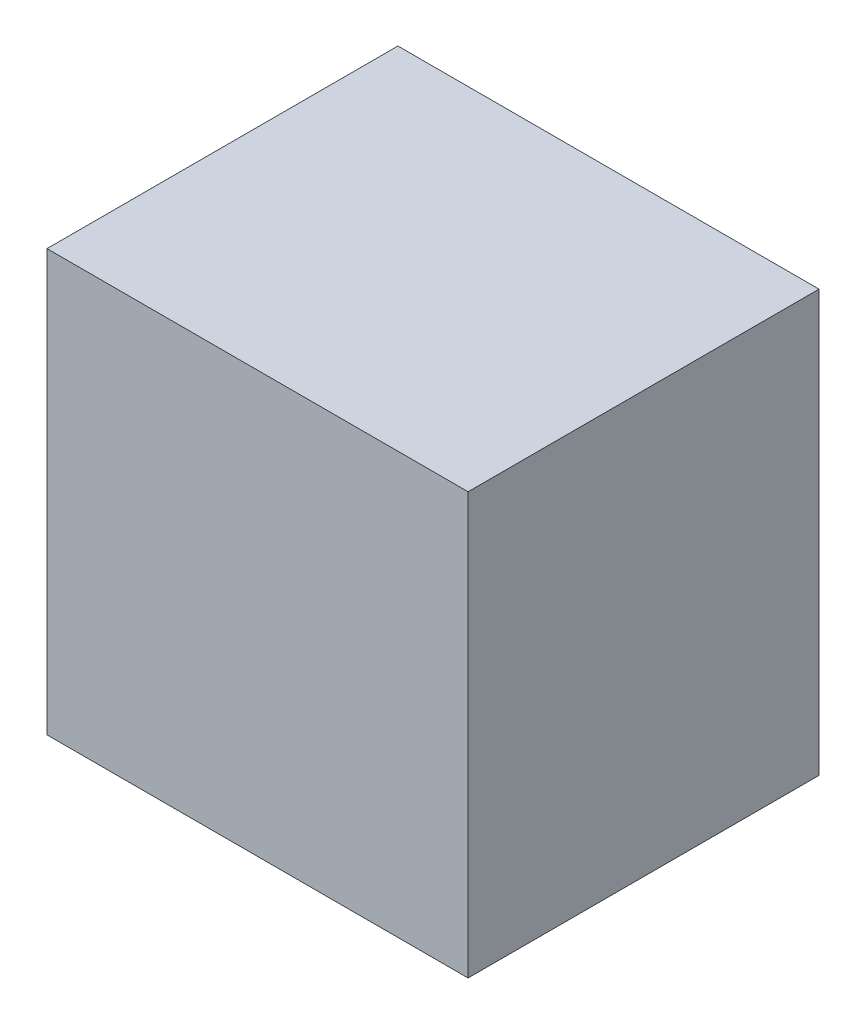
ISO-10303-21;
HEADER;
FILE_DESCRIPTION(('STEP AP214'),'2;1');
FILE_NAME('part.step','',(''),(''),'','','');
FILE_SCHEMA(('AUTOMOTIVE_DESIGN { 1 0 10303 214 1 1 1 1 }'));
ENDSEC;
DATA;
#1=APPLICATION_CONTEXT('core data for automotive mechanical design processes');
#2=APPLICATION_PROTOCOL_DEFINITION('international standard','automotive_design',2000,#1);
#3=PRODUCT_CONTEXT('',#1,'mechanical');
#4=PRODUCT('Part','Part','',(#3));
#5=PRODUCT_RELATED_PRODUCT_CATEGORY('part','',(#4));
#6=PRODUCT_DEFINITION_FORMATION('','',#4);
#7=PRODUCT_DEFINITION_CONTEXT('part definition',#1,'design');
#8=PRODUCT_DEFINITION('design','',#6,#7);
#9=PRODUCT_DEFINITION_SHAPE('','',#8);
#10=(LENGTH_UNIT() NAMED_UNIT(*) SI_UNIT(.MILLI.,.METRE.));
#11=(NAMED_UNIT(*) PLANE_ANGLE_UNIT() SI_UNIT($,.RADIAN.));
#12=(NAMED_UNIT(*) SI_UNIT($,.STERADIAN.) SOLID_ANGLE_UNIT());
#13=UNCERTAINTY_MEASURE_WITH_UNIT(LENGTH_MEASURE(1.E-05),#10,'distance_accuracy_value','');
#14=(GEOMETRIC_REPRESENTATION_CONTEXT(3) GLOBAL_UNCERTAINTY_ASSIGNED_CONTEXT((#13)) GLOBAL_UNIT_ASSIGNED_CONTEXT((#10,
#11,#12)) REPRESENTATION_CONTEXT('',''));
#15=CARTESIAN_POINT('',(0.,0.,0.));
#16=DIRECTION('',(0.,0.,1.));
#17=DIRECTION('',(1.,0.,0.));
#18=AXIS2_PLACEMENT_3D('',#15,#16,#17);
#19=CARTESIAN_POINT('',(30.,-30.,50.));
#20=DIRECTION('',(-1.,0.,0.));
#21=DIRECTION('',(0.,0.,1.));
#22=AXIS2_PLACEMENT_3D('',#19,#20,#21);
#23=PLANE('',#22);
#24=DIRECTION('',(0.,1.,0.));
#25=VECTOR('',#24,1.);
#26=CARTESIAN_POINT('',(30.,-30.,0.));
#27=LINE('',#26,#25);
#28=CARTESIAN_POINT('',(30.,-30.,0.));
#29=VERTEX_POINT('',#28);
#30=CARTESIAN_POINT('',(30.,30.,0.));
#31=VERTEX_POINT('',#30);
#32=EDGE_CURVE('E113',#29,#31,#27,.T.);
#33=ORIENTED_EDGE('',*,*,#32,.T.);
#34=DIRECTION('',(0.,0.,-1.));
#35=VECTOR('',#34,1.);
#36=CARTESIAN_POINT('',(30.,30.,50.));
#37=LINE('',#36,#35);
#38=CARTESIAN_POINT('',(30.,30.,50.));
#39=VERTEX_POINT('',#38);
#40=EDGE_CURVE('E11',#39,#31,#37,.T.);
#41=ORIENTED_EDGE('',*,*,#40,.F.);
#42=DIRECTION('',(0.,1.,0.));
#43=VECTOR('',#42,1.);
#44=CARTESIAN_POINT('',(30.,-30.,50.));
#45=LINE('',#44,#43);
#46=CARTESIAN_POINT('',(30.,-30.,50.));
#47=VERTEX_POINT('',#46);
#48=EDGE_CURVE('E97',#47,#39,#45,.T.);
#49=ORIENTED_EDGE('',*,*,#48,.F.);
#50=DIRECTION('',(0.,0.,-1.));
#51=VECTOR('',#50,1.);
#52=CARTESIAN_POINT('',(30.,-30.,50.));
#53=LINE('',#52,#51);
#54=EDGE_CURVE('E109',#47,#29,#53,.T.);
#55=ORIENTED_EDGE('',*,*,#54,.T.);
#56=EDGE_LOOP('',(#33,#41,#49,#55));
#57=FACE_BOUND('',#56,.T.);
#58=ADVANCED_FACE('F45',(#57),#23,.F.);
#59=CARTESIAN_POINT('',(-30.,30.,50.));
#60=DIRECTION('',(0.,-1.,0.));
#61=DIRECTION('',(0.,0.,-1.));
#62=AXIS2_PLACEMENT_3D('',#59,#60,#61);
#63=PLANE('',#62);
#64=DIRECTION('',(-1.,0.,0.));
#65=VECTOR('',#64,1.);
#66=CARTESIAN_POINT('',(-30.,30.,0.));
#67=LINE('',#66,#65);
#68=CARTESIAN_POINT('',(-30.,30.,0.));
#69=VERTEX_POINT('',#68);
#70=EDGE_CURVE('E102',#31,#69,#67,.T.);
#71=ORIENTED_EDGE('',*,*,#70,.T.);
#72=DIRECTION('',(0.,0.,-1.));
#73=VECTOR('',#72,1.);
#74=CARTESIAN_POINT('',(-30.,30.,50.));
#75=LINE('',#74,#73);
#76=CARTESIAN_POINT('',(-30.,30.,50.));
#77=VERTEX_POINT('',#76);
#78=EDGE_CURVE('E54',#77,#69,#75,.T.);
#79=ORIENTED_EDGE('',*,*,#78,.F.);
#80=DIRECTION('',(-1.,0.,0.));
#81=VECTOR('',#80,1.);
#82=CARTESIAN_POINT('',(-30.,30.,50.));
#83=LINE('',#82,#81);
#84=EDGE_CURVE('E92',#39,#77,#83,.T.);
#85=ORIENTED_EDGE('',*,*,#84,.F.);
#86=ORIENTED_EDGE('',*,*,#40,.T.);
#87=EDGE_LOOP('',(#71,#79,#85,#86));
#88=FACE_BOUND('',#87,.T.);
#89=ADVANCED_FACE('F101',(#88),#63,.F.);
#90=CARTESIAN_POINT('',(-30.,-30.,50.));
#91=DIRECTION('',(1.,0.,0.));
#92=DIRECTION('',(0.,0.,-1.));
#93=AXIS2_PLACEMENT_3D('',#90,#91,#92);
#94=PLANE('',#93);
#95=DIRECTION('',(0.,-1.,0.));
#96=VECTOR('',#95,1.);
#97=CARTESIAN_POINT('',(-30.,-30.,0.));
#98=LINE('',#97,#96);
#99=CARTESIAN_POINT('',(-30.,-30.,0.));
#100=VERTEX_POINT('',#99);
#101=EDGE_CURVE('E79',#69,#100,#98,.T.);
#102=ORIENTED_EDGE('',*,*,#101,.T.);
#103=DIRECTION('',(0.,0.,-1.));
#104=VECTOR('',#103,1.);
#105=CARTESIAN_POINT('',(-30.,-30.,50.));
#106=LINE('',#105,#104);
#107=CARTESIAN_POINT('',(-30.,-30.,50.));
#108=VERTEX_POINT('',#107);
#109=EDGE_CURVE('E104',#108,#100,#106,.T.);
#110=ORIENTED_EDGE('',*,*,#109,.F.);
#111=DIRECTION('',(0.,-1.,0.));
#112=VECTOR('',#111,1.);
#113=CARTESIAN_POINT('',(-30.,-30.,50.));
#114=LINE('',#113,#112);
#115=EDGE_CURVE('E95',#77,#108,#114,.T.);
#116=ORIENTED_EDGE('',*,*,#115,.F.);
#117=ORIENTED_EDGE('',*,*,#78,.T.);
#118=EDGE_LOOP('',(#102,#110,#116,#117));
#119=FACE_BOUND('',#118,.T.);
#120=ADVANCED_FACE('F105',(#119),#94,.F.);
#121=CARTESIAN_POINT('',(-30.,-30.,50.));
#122=DIRECTION('',(0.,1.,0.));
#123=DIRECTION('',(0.,0.,1.));
#124=AXIS2_PLACEMENT_3D('',#121,#122,#123);
#125=PLANE('',#124);
#126=DIRECTION('',(1.,0.,0.));
#127=VECTOR('',#126,1.);
#128=CARTESIAN_POINT('',(-30.,-30.,0.));
#129=LINE('',#128,#127);
#130=EDGE_CURVE('E85',#100,#29,#129,.T.);
#131=ORIENTED_EDGE('',*,*,#130,.T.);
#132=ORIENTED_EDGE('',*,*,#54,.F.);
#133=DIRECTION('',(1.,0.,0.));
#134=VECTOR('',#133,1.);
#135=CARTESIAN_POINT('',(-30.,-30.,50.));
#136=LINE('',#135,#134);
#137=EDGE_CURVE('E62',#108,#47,#136,.T.);
#138=ORIENTED_EDGE('',*,*,#137,.F.);
#139=ORIENTED_EDGE('',*,*,#109,.T.);
#140=EDGE_LOOP('',(#131,#132,#138,#139));
#141=FACE_BOUND('',#140,.T.);
#142=ADVANCED_FACE('F126',(#141),#125,.F.);
#143=CARTESIAN_POINT('',(0.,0.,50.));
#144=DIRECTION('',(0.,0.,-1.));
#145=DIRECTION('',(-1.,0.,0.));
#146=AXIS2_PLACEMENT_3D('',#143,#144,#145);
#147=PLANE('',#146);
#148=ORIENTED_EDGE('',*,*,#48,.T.);
#149=ORIENTED_EDGE('',*,*,#84,.T.);
#150=ORIENTED_EDGE('',*,*,#115,.T.);
#151=ORIENTED_EDGE('',*,*,#137,.T.);
#152=EDGE_LOOP('',(#148,#149,#150,#151));
#153=FACE_BOUND('',#152,.T.);
#154=ADVANCED_FACE('F93',(#153),#147,.F.);
#155=CARTESIAN_POINT('',(0.,0.,0.));
#156=DIRECTION('',(0.,0.,-1.));
#157=DIRECTION('',(-1.,0.,0.));
#158=AXIS2_PLACEMENT_3D('',#155,#156,#157);
#159=PLANE('',#158);
#160=ORIENTED_EDGE('',*,*,#32,.F.);
#161=ORIENTED_EDGE('',*,*,#130,.F.);
#162=ORIENTED_EDGE('',*,*,#101,.F.);
#163=ORIENTED_EDGE('',*,*,#70,.F.);
#164=EDGE_LOOP('',(#160,#161,#162,#163));
#165=FACE_BOUND('',#164,.T.);
#166=ADVANCED_FACE('F129',(#165),#159,.T.);
#167=CLOSED_SHELL('',(#58,#89,#120,#142,#154,#166));
#168=MANIFOLD_SOLID_BREP('B2',#167);
#169=ADVANCED_BREP_SHAPE_REPRESENTATION('',(#18,#168),#14);
#170=SHAPE_DEFINITION_REPRESENTATION(#9,#169);
ENDSEC;
END-ISO-10303-21;
